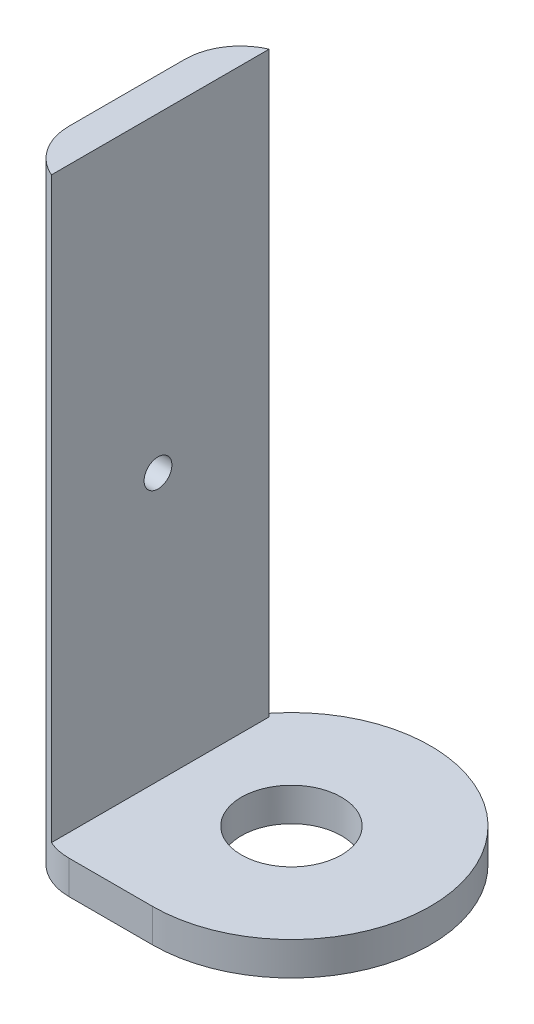
ISO-10303-21;
HEADER;
FILE_DESCRIPTION(('STEP AP214'),'2;1');
FILE_NAME('part.step','',(''),(''),'','','');
FILE_SCHEMA(('AUTOMOTIVE_DESIGN { 1 0 10303 214 1 1 1 1 }'));
ENDSEC;
DATA;
#1=APPLICATION_CONTEXT('core data for automotive mechanical design processes');
#2=APPLICATION_PROTOCOL_DEFINITION('international standard','automotive_design',2000,#1);
#3=PRODUCT_CONTEXT('',#1,'mechanical');
#4=PRODUCT('Part','Part','',(#3));
#5=PRODUCT_RELATED_PRODUCT_CATEGORY('part','',(#4));
#6=PRODUCT_DEFINITION_FORMATION('','',#4);
#7=PRODUCT_DEFINITION_CONTEXT('part definition',#1,'design');
#8=PRODUCT_DEFINITION('design','',#6,#7);
#9=PRODUCT_DEFINITION_SHAPE('','',#8);
#10=(LENGTH_UNIT() NAMED_UNIT(*) SI_UNIT(.MILLI.,.METRE.));
#11=(NAMED_UNIT(*) PLANE_ANGLE_UNIT() SI_UNIT($,.RADIAN.));
#12=(NAMED_UNIT(*) SI_UNIT($,.STERADIAN.) SOLID_ANGLE_UNIT());
#13=UNCERTAINTY_MEASURE_WITH_UNIT(LENGTH_MEASURE(1.E-05),#10,'distance_accuracy_value','');
#14=(GEOMETRIC_REPRESENTATION_CONTEXT(3) GLOBAL_UNCERTAINTY_ASSIGNED_CONTEXT((#13)) GLOBAL_UNIT_ASSIGNED_CONTEXT((#10,
#11,#12)) REPRESENTATION_CONTEXT('',''));
#15=CARTESIAN_POINT('',(0.,0.,0.));
#16=DIRECTION('',(0.,0.,1.));
#17=DIRECTION('',(1.,0.,0.));
#18=AXIS2_PLACEMENT_3D('',#15,#16,#17);
#19=CARTESIAN_POINT('',(-12.5,3.,0.));
#20=DIRECTION('',(-1.,0.,0.));
#21=DIRECTION('',(0.,0.,1.));
#22=AXIS2_PLACEMENT_3D('',#19,#20,#21);
#23=PLANE('',#22);
#24=CARTESIAN_POINT('',(-12.5,27.,2.5));
#25=DIRECTION('',(-1.,0.,0.));
#26=DIRECTION('',(0.,0.,1.));
#27=AXIS2_PLACEMENT_3D('',#24,#25,#26);
#28=CIRCLE('',#27,1.25);
#29=CARTESIAN_POINT('',(-12.5,27.,3.75000000000001));
#30=VERTEX_POINT('',#29);
#31=EDGE_CURVE('E240',#30,#30,#28,.T.);
#32=ORIENTED_EDGE('',*,*,#31,.F.);
#33=EDGE_LOOP('',(#32));
#34=FACE_BOUND('',#33,.T.);
#35=DIRECTION('',(0.,0.,-1.));
#36=VECTOR('',#35,1.);
#37=CARTESIAN_POINT('',(-12.5,0.,0.));
#38=LINE('',#37,#36);
#39=CARTESIAN_POINT('',(-12.5,0.,7.5));
#40=VERTEX_POINT('',#39);
#41=CARTESIAN_POINT('',(-12.5,0.,-2.91742430504416));
#42=VERTEX_POINT('',#41);
#43=EDGE_CURVE('E211',#40,#42,#38,.T.);
#44=ORIENTED_EDGE('',*,*,#43,.F.);
#45=DIRECTION('',(0.,-1.,0.));
#46=VECTOR('',#45,1.);
#47=CARTESIAN_POINT('',(-12.5,55.,7.5));
#48=LINE('',#47,#46);
#49=CARTESIAN_POINT('',(-12.5,55.,7.5));
#50=VERTEX_POINT('',#49);
#51=EDGE_CURVE('E165',#40,#50,#48,.F.);
#52=ORIENTED_EDGE('',*,*,#51,.T.);
#53=DIRECTION('',(0.,0.,-1.));
#54=VECTOR('',#53,1.);
#55=CARTESIAN_POINT('',(-12.5,55.,0.));
#56=LINE('',#55,#54);
#57=CARTESIAN_POINT('',(-12.5,55.,-2.91742430504416));
#58=VERTEX_POINT('',#57);
#59=EDGE_CURVE('E159',#50,#58,#56,.T.);
#60=ORIENTED_EDGE('',*,*,#59,.T.);
#61=DIRECTION('',(0.,1.,0.));
#62=VECTOR('',#61,1.);
#63=CARTESIAN_POINT('',(-12.5,0.,-2.91742430504416));
#64=LINE('',#63,#62);
#65=EDGE_CURVE('E163',#58,#42,#64,.F.);
#66=ORIENTED_EDGE('',*,*,#65,.T.);
#67=EDGE_LOOP('',(#44,#52,#60,#66));
#68=FACE_BOUND('',#67,.T.);
#69=ADVANCED_FACE('F81',(#34,#68),#23,.T.);
#70=CARTESIAN_POINT('',(0.,3.,12.5));
#71=DIRECTION('',(0.,0.,-1.));
#72=DIRECTION('',(-1.,0.,0.));
#73=AXIS2_PLACEMENT_3D('',#70,#71,#72);
#74=PLANE('',#73);
#75=DIRECTION('',(1.,0.,0.));
#76=VECTOR('',#75,1.);
#77=CARTESIAN_POINT('',(0.,3.,12.5));
#78=LINE('',#77,#76);
#79=CARTESIAN_POINT('',(-7.5,3.,12.5));
#80=VERTEX_POINT('',#79);
#81=CARTESIAN_POINT('',(0.,3.,12.5));
#82=VERTEX_POINT('',#81);
#83=EDGE_CURVE('E219',#80,#82,#78,.T.);
#84=ORIENTED_EDGE('',*,*,#83,.F.);
#85=DIRECTION('',(0.,-1.,0.));
#86=VECTOR('',#85,1.);
#87=CARTESIAN_POINT('',(-7.5,0.,12.5));
#88=LINE('',#87,#86);
#89=CARTESIAN_POINT('',(-7.5,0.,12.5));
#90=VERTEX_POINT('',#89);
#91=EDGE_CURVE('E188',#80,#90,#88,.T.);
#92=ORIENTED_EDGE('',*,*,#91,.T.);
#93=DIRECTION('',(1.,0.,0.));
#94=VECTOR('',#93,1.);
#95=CARTESIAN_POINT('',(0.,0.,12.5));
#96=LINE('',#95,#94);
#97=CARTESIAN_POINT('',(0.,0.,12.5));
#98=VERTEX_POINT('',#97);
#99=EDGE_CURVE('E215',#90,#98,#96,.T.);
#100=ORIENTED_EDGE('',*,*,#99,.T.);
#101=DIRECTION('',(0.,-1.,0.));
#102=VECTOR('',#101,1.);
#103=CARTESIAN_POINT('',(0.,3.,12.5));
#104=LINE('',#103,#102);
#105=EDGE_CURVE('E189',#82,#98,#104,.T.);
#106=ORIENTED_EDGE('',*,*,#105,.F.);
#107=EDGE_LOOP('',(#84,#92,#100,#106));
#108=FACE_BOUND('',#107,.T.);
#109=ADVANCED_FACE('F249',(#108),#74,.F.);
#110=CARTESIAN_POINT('',(0.,0.,0.));
#111=DIRECTION('',(0.,1.,0.));
#112=DIRECTION('',(0.,0.,1.));
#113=AXIS2_PLACEMENT_3D('',#110,#111,#112);
#114=PLANE('',#113);
#115=CARTESIAN_POINT('',(0.,0.,0.));
#116=DIRECTION('',(0.,-1.,0.));
#117=DIRECTION('',(0.,0.,-1.));
#118=AXIS2_PLACEMENT_3D('',#115,#116,#117);
#119=CIRCLE('',#118,4.5);
#120=CARTESIAN_POINT('',(0.,0.,-4.5));
#121=VERTEX_POINT('',#120);
#122=EDGE_CURVE('E232',#121,#121,#119,.T.);
#123=ORIENTED_EDGE('',*,*,#122,.F.);
#124=EDGE_LOOP('',(#123));
#125=FACE_BOUND('',#124,.T.);
#126=ORIENTED_EDGE('',*,*,#99,.F.);
#127=CARTESIAN_POINT('',(-7.5,0.,7.5));
#128=DIRECTION('',(0.,1.,0.));
#129=DIRECTION('',(0.,0.,1.));
#130=AXIS2_PLACEMENT_3D('',#127,#128,#129);
#131=CIRCLE('',#130,5.);
#132=EDGE_CURVE('E196',#90,#40,#131,.F.);
#133=ORIENTED_EDGE('',*,*,#132,.T.);
#134=ORIENTED_EDGE('',*,*,#43,.T.);
#135=CARTESIAN_POINT('',(-7.5,0.,-2.91742430504416));
#136=DIRECTION('',(0.,1.,0.));
#137=DIRECTION('',(0.,0.,1.));
#138=AXIS2_PLACEMENT_3D('',#135,#136,#137);
#139=CIRCLE('',#138,5.);
#140=CARTESIAN_POINT('',(-10.3288391886058,0.,-7.04024722690342));
#141=VERTEX_POINT('',#140);
#142=EDGE_CURVE('E200',#42,#141,#139,.F.);
#143=ORIENTED_EDGE('',*,*,#142,.T.);
#144=CARTESIAN_POINT('',(0.,0.,0.));
#145=DIRECTION('',(0.,1.,0.));
#146=DIRECTION('',(0.,0.,1.));
#147=AXIS2_PLACEMENT_3D('',#144,#145,#146);
#148=CIRCLE('',#147,12.5);
#149=EDGE_CURVE('E149',#98,#141,#148,.T.);
#150=ORIENTED_EDGE('',*,*,#149,.F.);
#151=EDGE_LOOP('',(#126,#133,#134,#143,#150));
#152=FACE_BOUND('',#151,.T.);
#153=ADVANCED_FACE('F213',(#125,#152),#114,.F.);
#154=CARTESIAN_POINT('',(0.,3.,0.));
#155=DIRECTION('',(0.,1.,0.));
#156=DIRECTION('',(0.,0.,1.));
#157=AXIS2_PLACEMENT_3D('',#154,#155,#156);
#158=PLANE('',#157);
#159=CARTESIAN_POINT('',(0.,3.,0.));
#160=DIRECTION('',(0.,1.,0.));
#161=DIRECTION('',(0.,0.,1.));
#162=AXIS2_PLACEMENT_3D('',#159,#160,#161);
#163=CIRCLE('',#162,4.5);
#164=CARTESIAN_POINT('',(0.,3.,4.5));
#165=VERTEX_POINT('',#164);
#166=EDGE_CURVE('E228',#165,#165,#163,.T.);
#167=ORIENTED_EDGE('',*,*,#166,.F.);
#168=EDGE_LOOP('',(#167));
#169=FACE_BOUND('',#168,.T.);
#170=DIRECTION('',(0.,0.,-1.));
#171=VECTOR('',#170,1.);
#172=CARTESIAN_POINT('',(-9.5,3.,0.));
#173=LINE('',#172,#171);
#174=CARTESIAN_POINT('',(-9.5,3.,12.0825756949558));
#175=VERTEX_POINT('',#174);
#176=CARTESIAN_POINT('',(-9.5,3.,-7.5));
#177=VERTEX_POINT('',#176);
#178=EDGE_CURVE('E144',#175,#177,#173,.T.);
#179=ORIENTED_EDGE('',*,*,#178,.F.);
#180=CARTESIAN_POINT('',(-7.5,3.,7.5));
#181=DIRECTION('',(0.,1.,0.));
#182=DIRECTION('',(0.,0.,1.));
#183=AXIS2_PLACEMENT_3D('',#180,#181,#182);
#184=CIRCLE('',#183,5.);
#185=EDGE_CURVE('E175',#175,#80,#184,.T.);
#186=ORIENTED_EDGE('',*,*,#185,.T.);
#187=ORIENTED_EDGE('',*,*,#83,.T.);
#188=CARTESIAN_POINT('',(0.,3.,0.));
#189=DIRECTION('',(0.,1.,0.));
#190=DIRECTION('',(0.,0.,1.));
#191=AXIS2_PLACEMENT_3D('',#188,#189,#190);
#192=CIRCLE('',#191,12.5);
#193=CARTESIAN_POINT('',(-10.3288391886058,3.,-7.04024722690342));
#194=VERTEX_POINT('',#193);
#195=EDGE_CURVE('E96',#82,#194,#192,.T.);
#196=ORIENTED_EDGE('',*,*,#195,.T.);
#197=CARTESIAN_POINT('',(-7.5,3.,-2.91742430504416));
#198=DIRECTION('',(0.,1.,0.));
#199=DIRECTION('',(0.,0.,1.));
#200=AXIS2_PLACEMENT_3D('',#197,#198,#199);
#201=CIRCLE('',#200,5.);
#202=EDGE_CURVE('E12',#194,#177,#201,.F.);
#203=ORIENTED_EDGE('',*,*,#202,.T.);
#204=EDGE_LOOP('',(#179,#186,#187,#196,#203));
#205=FACE_BOUND('',#204,.T.);
#206=ADVANCED_FACE('F184',(#169,#205),#158,.T.);
#207=CARTESIAN_POINT('',(0.,3.,0.));
#208=DIRECTION('',(0.,-1.,0.));
#209=DIRECTION('',(0.,0.,-1.));
#210=AXIS2_PLACEMENT_3D('',#207,#208,#209);
#211=CYLINDRICAL_SURFACE('',#210,12.5);
#212=ORIENTED_EDGE('',*,*,#105,.T.);
#213=ORIENTED_EDGE('',*,*,#149,.T.);
#214=DIRECTION('',(0.,-1.,0.));
#215=VECTOR('',#214,1.);
#216=CARTESIAN_POINT('',(-10.3288391886058,0.,-7.04024722690342));
#217=LINE('',#216,#215);
#218=EDGE_CURVE('E90',#141,#194,#217,.F.);
#219=ORIENTED_EDGE('',*,*,#218,.T.);
#220=ORIENTED_EDGE('',*,*,#195,.F.);
#221=EDGE_LOOP('',(#212,#213,#219,#220));
#222=FACE_BOUND('',#221,.T.);
#223=ADVANCED_FACE('F181',(#222),#211,.T.);
#224=CARTESIAN_POINT('',(-9.5,55.,0.));
#225=DIRECTION('',(1.,0.,0.));
#226=DIRECTION('',(0.,0.,-1.));
#227=AXIS2_PLACEMENT_3D('',#224,#225,#226);
#228=PLANE('',#227);
#229=CARTESIAN_POINT('',(-9.5,27.,2.5));
#230=DIRECTION('',(1.,0.,0.));
#231=DIRECTION('',(0.,0.,-1.));
#232=AXIS2_PLACEMENT_3D('',#229,#230,#231);
#233=CIRCLE('',#232,1.25);
#234=CARTESIAN_POINT('',(-9.5,27.,1.25000000000001));
#235=VERTEX_POINT('',#234);
#236=EDGE_CURVE('E236',#235,#235,#233,.T.);
#237=ORIENTED_EDGE('',*,*,#236,.F.);
#238=EDGE_LOOP('',(#237));
#239=FACE_BOUND('',#238,.T.);
#240=DIRECTION('',(0.,0.,1.));
#241=VECTOR('',#240,1.);
#242=CARTESIAN_POINT('',(-9.5,55.,0.));
#243=LINE('',#242,#241);
#244=CARTESIAN_POINT('',(-9.5,55.,-7.5));
#245=VERTEX_POINT('',#244);
#246=CARTESIAN_POINT('',(-9.5,55.,12.0825756949558));
#247=VERTEX_POINT('',#246);
#248=EDGE_CURVE('E143',#245,#247,#243,.T.);
#249=ORIENTED_EDGE('',*,*,#248,.T.);
#250=DIRECTION('',(0.,1.,0.));
#251=VECTOR('',#250,1.);
#252=CARTESIAN_POINT('',(-9.5,55.,12.0825756949558));
#253=LINE('',#252,#251);
#254=EDGE_CURVE('E104',#247,#175,#253,.F.);
#255=ORIENTED_EDGE('',*,*,#254,.T.);
#256=ORIENTED_EDGE('',*,*,#178,.T.);
#257=DIRECTION('',(0.,-1.,0.));
#258=VECTOR('',#257,1.);
#259=CARTESIAN_POINT('',(-9.5,55.,-7.5));
#260=LINE('',#259,#258);
#261=EDGE_CURVE('E140',#245,#177,#260,.T.);
#262=ORIENTED_EDGE('',*,*,#261,.F.);
#263=EDGE_LOOP('',(#249,#255,#256,#262));
#264=FACE_BOUND('',#263,.T.);
#265=ADVANCED_FACE('F142',(#239,#264),#228,.T.);
#266=CARTESIAN_POINT('',(0.,55.,0.));
#267=DIRECTION('',(0.,1.,0.));
#268=DIRECTION('',(0.,0.,1.));
#269=AXIS2_PLACEMENT_3D('',#266,#267,#268);
#270=PLANE('',#269);
#271=ORIENTED_EDGE('',*,*,#59,.F.);
#272=CARTESIAN_POINT('',(-7.5,55.,7.5));
#273=DIRECTION('',(0.,1.,0.));
#274=DIRECTION('',(0.,0.,1.));
#275=AXIS2_PLACEMENT_3D('',#272,#273,#274);
#276=CIRCLE('',#275,5.);
#277=EDGE_CURVE('E157',#50,#247,#276,.T.);
#278=ORIENTED_EDGE('',*,*,#277,.T.);
#279=ORIENTED_EDGE('',*,*,#248,.F.);
#280=CARTESIAN_POINT('',(-7.5,55.,-2.91742430504416));
#281=DIRECTION('',(0.,1.,0.));
#282=DIRECTION('',(0.,0.,1.));
#283=AXIS2_PLACEMENT_3D('',#280,#281,#282);
#284=CIRCLE('',#283,5.);
#285=EDGE_CURVE('E154',#245,#58,#284,.T.);
#286=ORIENTED_EDGE('',*,*,#285,.T.);
#287=EDGE_LOOP('',(#271,#278,#279,#286));
#288=FACE_BOUND('',#287,.T.);
#289=ADVANCED_FACE('F153',(#288),#270,.T.);
#290=CARTESIAN_POINT('',(0.,0.,0.));
#291=DIRECTION('',(0.,-1.,0.));
#292=DIRECTION('',(0.,0.,-1.));
#293=AXIS2_PLACEMENT_3D('',#290,#291,#292);
#294=CYLINDRICAL_SURFACE('',#293,4.5);
#295=ORIENTED_EDGE('',*,*,#166,.T.);
#296=EDGE_LOOP('',(#295));
#297=FACE_BOUND('',#296,.T.);
#298=ORIENTED_EDGE('',*,*,#122,.T.);
#299=EDGE_LOOP('',(#298));
#300=FACE_BOUND('',#299,.T.);
#301=ADVANCED_FACE('F263',(#297,#300),#294,.F.);
#302=CARTESIAN_POINT('',(-12.5,27.,2.5));
#303=DIRECTION('',(-1.,0.,0.));
#304=DIRECTION('',(0.,0.,1.));
#305=AXIS2_PLACEMENT_3D('',#302,#303,#304);
#306=CYLINDRICAL_SURFACE('',#305,1.25);
#307=ORIENTED_EDGE('',*,*,#236,.T.);
#308=EDGE_LOOP('',(#307));
#309=FACE_BOUND('',#308,.T.);
#310=ORIENTED_EDGE('',*,*,#31,.T.);
#311=EDGE_LOOP('',(#310));
#312=FACE_BOUND('',#311,.T.);
#313=ADVANCED_FACE('F246',(#309,#312),#306,.F.);
#314=CARTESIAN_POINT('',(-7.5,3.,7.5));
#315=DIRECTION('',(0.,1.,0.));
#316=DIRECTION('',(0.,0.,1.));
#317=AXIS2_PLACEMENT_3D('',#314,#315,#316);
#318=CYLINDRICAL_SURFACE('',#317,5.);
#319=ORIENTED_EDGE('',*,*,#277,.F.);
#320=ORIENTED_EDGE('',*,*,#51,.F.);
#321=ORIENTED_EDGE('',*,*,#132,.F.);
#322=ORIENTED_EDGE('',*,*,#91,.F.);
#323=ORIENTED_EDGE('',*,*,#185,.F.);
#324=ORIENTED_EDGE('',*,*,#254,.F.);
#325=EDGE_LOOP('',(#319,#320,#321,#322,#323,#324));
#326=FACE_BOUND('',#325,.T.);
#327=ADVANCED_FACE('F193',(#326),#318,.T.);
#328=CARTESIAN_POINT('',(-7.5,3.,-2.91742430504416));
#329=DIRECTION('',(0.,-1.,0.));
#330=DIRECTION('',(0.,0.,-1.));
#331=AXIS2_PLACEMENT_3D('',#328,#329,#330);
#332=CYLINDRICAL_SURFACE('',#331,5.);
#333=ORIENTED_EDGE('',*,*,#285,.F.);
#334=ORIENTED_EDGE('',*,*,#261,.T.);
#335=ORIENTED_EDGE('',*,*,#202,.F.);
#336=ORIENTED_EDGE('',*,*,#218,.F.);
#337=ORIENTED_EDGE('',*,*,#142,.F.);
#338=ORIENTED_EDGE('',*,*,#65,.F.);
#339=EDGE_LOOP('',(#333,#334,#335,#336,#337,#338));
#340=FACE_BOUND('',#339,.T.);
#341=ADVANCED_FACE('F83',(#340),#332,.T.);
#342=CLOSED_SHELL('',(#69,#109,#153,#206,#223,#265,#289,#301,#313,#327,#341));
#343=MANIFOLD_SOLID_BREP('B2',#342);
#344=ADVANCED_BREP_SHAPE_REPRESENTATION('',(#18,#343),#14);
#345=SHAPE_DEFINITION_REPRESENTATION(#9,#344);
ENDSEC;
END-ISO-10303-21;
